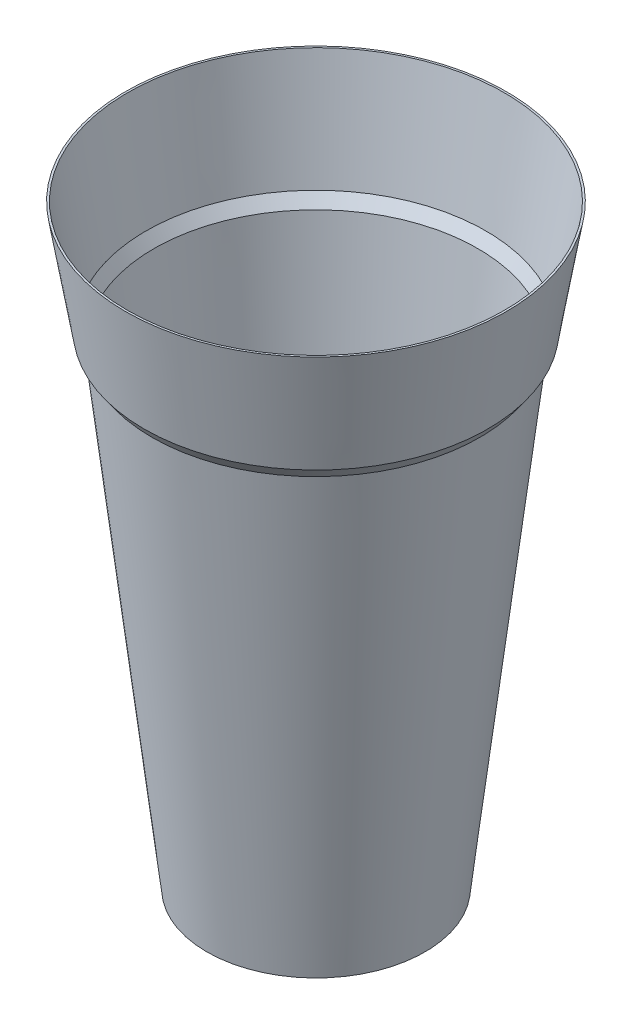
ISO-10303-21;
HEADER;
FILE_DESCRIPTION(('STEP AP214'),'2;1');
FILE_NAME('part.step','',(''),(''),'','','');
FILE_SCHEMA(('AUTOMOTIVE_DESIGN { 1 0 10303 214 1 1 1 1 }'));
ENDSEC;
DATA;
#1=APPLICATION_CONTEXT('core data for automotive mechanical design processes');
#2=APPLICATION_PROTOCOL_DEFINITION('international standard','automotive_design',2000,#1);
#3=PRODUCT_CONTEXT('',#1,'mechanical');
#4=PRODUCT('Part','Part','',(#3));
#5=PRODUCT_RELATED_PRODUCT_CATEGORY('part','',(#4));
#6=PRODUCT_DEFINITION_FORMATION('','',#4);
#7=PRODUCT_DEFINITION_CONTEXT('part definition',#1,'design');
#8=PRODUCT_DEFINITION('design','',#6,#7);
#9=PRODUCT_DEFINITION_SHAPE('','',#8);
#10=(LENGTH_UNIT() NAMED_UNIT(*) SI_UNIT(.MILLI.,.METRE.));
#11=(NAMED_UNIT(*) PLANE_ANGLE_UNIT() SI_UNIT($,.RADIAN.));
#12=(NAMED_UNIT(*) SI_UNIT($,.STERADIAN.) SOLID_ANGLE_UNIT());
#13=UNCERTAINTY_MEASURE_WITH_UNIT(LENGTH_MEASURE(1.E-05),#10,'distance_accuracy_value','');
#14=(GEOMETRIC_REPRESENTATION_CONTEXT(3) GLOBAL_UNCERTAINTY_ASSIGNED_CONTEXT((#13)) GLOBAL_UNIT_ASSIGNED_CONTEXT((#10,
#11,#12)) REPRESENTATION_CONTEXT('',''));
#15=CARTESIAN_POINT('',(0.,0.,0.));
#16=DIRECTION('',(0.,0.,1.));
#17=DIRECTION('',(1.,0.,0.));
#18=AXIS2_PLACEMENT_3D('',#15,#16,#17);
#19=CARTESIAN_POINT('',(-27.5,0.,28.05));
#20=DIRECTION('',(0.,-1.,0.));
#21=DIRECTION('',(0.,0.,-1.));
#22=AXIS2_PLACEMENT_3D('',#19,#20,#21);
#23=PLANE('',#22);
#24=CARTESIAN_POINT('',(0.,0.,0.));
#25=DIRECTION('',(0.,1.,0.));
#26=DIRECTION('',(0.,0.,1.));
#27=AXIS2_PLACEMENT_3D('',#24,#25,#26);
#28=CIRCLE('',#27,27.5);
#29=CARTESIAN_POINT('',(0.,0.,27.5));
#30=VERTEX_POINT('',#29);
#31=EDGE_CURVE('E17',#30,#30,#28,.T.);
#32=ORIENTED_EDGE('',*,*,#31,.F.);
#33=EDGE_LOOP('',(#32));
#34=FACE_BOUND('',#33,.T.);
#35=ADVANCED_FACE('F13',(#34),#23,.T.);
#36=CARTESIAN_POINT('',(0.,0.,0.));
#37=DIRECTION('',(0.,1.,0.));
#38=DIRECTION('',(0.,0.,1.));
#39=AXIS2_PLACEMENT_3D('',#36,#37,#38);
#40=CONICAL_SURFACE('',#39,27.5,0.115191730631625);
#41=CARTESIAN_POINT('',(0.,119.16,0.));
#42=DIRECTION('',(0.,1.,0.));
#43=DIRECTION('',(0.,0.,1.));
#44=AXIS2_PLACEMENT_3D('',#41,#42,#43);
#45=CIRCLE('',#44,41.2872824049611);
#46=CARTESIAN_POINT('',(0.,119.16,41.2872824049611));
#47=VERTEX_POINT('',#46);
#48=EDGE_CURVE('E40',#47,#47,#45,.T.);
#49=ORIENTED_EDGE('',*,*,#48,.F.);
#50=EDGE_LOOP('',(#49));
#51=FACE_BOUND('',#50,.T.);
#52=ORIENTED_EDGE('',*,*,#31,.T.);
#53=EDGE_LOOP('',(#52));
#54=FACE_BOUND('',#53,.T.);
#55=ADVANCED_FACE('F120',(#51,#54),#40,.T.);
#56=CARTESIAN_POINT('',(0.,119.16,0.));
#57=DIRECTION('',(0.,1.,0.));
#58=DIRECTION('',(0.,0.,1.));
#59=AXIS2_PLACEMENT_3D('',#56,#57,#58);
#60=CONICAL_SURFACE('',#59,41.2872824049611,0.613556145511916);
#61=CARTESIAN_POINT('',(0.,122.,0.));
#62=DIRECTION('',(0.,1.,0.));
#63=DIRECTION('',(0.,0.,1.));
#64=AXIS2_PLACEMENT_3D('',#61,#62,#63);
#65=CIRCLE('',#64,43.2872824049611);
#66=CARTESIAN_POINT('',(0.,122.,43.2872824049611));
#67=VERTEX_POINT('',#66);
#68=EDGE_CURVE('E36',#67,#67,#65,.T.);
#69=ORIENTED_EDGE('',*,*,#68,.F.);
#70=EDGE_LOOP('',(#69));
#71=FACE_BOUND('',#70,.T.);
#72=ORIENTED_EDGE('',*,*,#48,.T.);
#73=EDGE_LOOP('',(#72));
#74=FACE_BOUND('',#73,.T.);
#75=ADVANCED_FACE('F110',(#71,#74),#60,.T.);
#76=CARTESIAN_POINT('',(0.,122.,0.));
#77=DIRECTION('',(0.,1.,0.));
#78=DIRECTION('',(0.,0.,1.));
#79=AXIS2_PLACEMENT_3D('',#76,#77,#78);
#80=CONICAL_SURFACE('',#79,43.2872824049611,0.166748474686998);
#81=CARTESIAN_POINT('',(0.,150.,0.));
#82=DIRECTION('',(0.,1.,0.));
#83=DIRECTION('',(0.,0.,1.));
#84=AXIS2_PLACEMENT_3D('',#81,#82,#83);
#85=CIRCLE('',#84,48.);
#86=CARTESIAN_POINT('',(0.,150.,48.));
#87=VERTEX_POINT('',#86);
#88=EDGE_CURVE('E34',#87,#87,#85,.T.);
#89=ORIENTED_EDGE('',*,*,#88,.F.);
#90=EDGE_LOOP('',(#89));
#91=FACE_BOUND('',#90,.T.);
#92=ORIENTED_EDGE('',*,*,#68,.T.);
#93=EDGE_LOOP('',(#92));
#94=FACE_BOUND('',#93,.T.);
#95=ADVANCED_FACE('F70',(#91,#94),#80,.T.);
#96=CARTESIAN_POINT('',(-48.,150.,-48.96));
#97=DIRECTION('',(0.,1.,0.));
#98=DIRECTION('',(0.,0.,1.));
#99=AXIS2_PLACEMENT_3D('',#96,#97,#98);
#100=PLANE('',#99);
#101=CARTESIAN_POINT('',(0.,150.,0.));
#102=DIRECTION('',(0.,1.,0.));
#103=DIRECTION('',(0.,0.,1.));
#104=AXIS2_PLACEMENT_3D('',#101,#102,#103);
#105=CIRCLE('',#104,47.4929672821023);
#106=CARTESIAN_POINT('',(0.,150.,47.4929672821023));
#107=VERTEX_POINT('',#106);
#108=EDGE_CURVE('E32',#107,#107,#105,.T.);
#109=ORIENTED_EDGE('',*,*,#108,.F.);
#110=EDGE_LOOP('',(#109));
#111=FACE_BOUND('',#110,.T.);
#112=ORIENTED_EDGE('',*,*,#88,.T.);
#113=EDGE_LOOP('',(#112));
#114=FACE_BOUND('',#113,.T.);
#115=ADVANCED_FACE('F60',(#111,#114),#100,.T.);
#116=CARTESIAN_POINT('',(0.,150.,0.));
#117=DIRECTION('',(0.,1.,0.));
#118=DIRECTION('',(0.,0.,1.));
#119=AXIS2_PLACEMENT_3D('',#116,#117,#118);
#120=CONICAL_SURFACE('',#119,47.4929672821023,0.166748474686995);
#121=ORIENTED_EDGE('',*,*,#108,.T.);
#122=EDGE_LOOP('',(#121));
#123=FACE_BOUND('',#122,.T.);
#124=CARTESIAN_POINT('',(0.,122.195010860724,0.));
#125=DIRECTION('',(0.,1.,0.));
#126=DIRECTION('',(0.,0.,1.));
#127=AXIS2_PLACEMENT_3D('',#124,#125,#126);
#128=CIRCLE('',#127,42.8130722268691);
#129=CARTESIAN_POINT('',(0.,122.195010860724,42.8130722268691));
#130=VERTEX_POINT('',#129);
#131=EDGE_CURVE('E26',#130,#130,#128,.T.);
#132=ORIENTED_EDGE('',*,*,#131,.F.);
#133=EDGE_LOOP('',(#132));
#134=FACE_BOUND('',#133,.T.);
#135=ADVANCED_FACE('F58',(#123,#134),#120,.F.);
#136=CARTESIAN_POINT('',(0.,122.195010860724,0.));
#137=DIRECTION('',(0.,1.,0.));
#138=DIRECTION('',(0.,0.,1.));
#139=AXIS2_PLACEMENT_3D('',#136,#137,#138);
#140=CONICAL_SURFACE('',#139,42.8130722268691,0.613556145511873);
#141=ORIENTED_EDGE('',*,*,#131,.T.);
#142=EDGE_LOOP('',(#141));
#143=FACE_BOUND('',#142,.T.);
#144=CARTESIAN_POINT('',(0.,119.343860851129,0.));
#145=DIRECTION('',(0.,1.,0.));
#146=DIRECTION('',(0.,0.,1.));
#147=AXIS2_PLACEMENT_3D('',#144,#145,#146);
#148=CIRCLE('',#147,40.8052201074362);
#149=CARTESIAN_POINT('',(0.,119.343860851129,40.8052201074362));
#150=VERTEX_POINT('',#149);
#151=EDGE_CURVE('E21',#150,#150,#148,.T.);
#152=ORIENTED_EDGE('',*,*,#151,.F.);
#153=EDGE_LOOP('',(#152));
#154=FACE_BOUND('',#153,.T.);
#155=ADVANCED_FACE('F55',(#143,#154),#140,.F.);
#156=CARTESIAN_POINT('',(0.,119.343860851129,0.));
#157=DIRECTION('',(0.,1.,0.));
#158=DIRECTION('',(0.,0.,1.));
#159=AXIS2_PLACEMENT_3D('',#156,#157,#158);
#160=CONICAL_SURFACE('',#159,40.8052201074362,0.115191730631625);
#161=ORIENTED_EDGE('',*,*,#151,.T.);
#162=EDGE_LOOP('',(#161));
#163=FACE_BOUND('',#162,.T.);
#164=CARTESIAN_POINT('',(0.,0.5,0.));
#165=DIRECTION('',(0.,1.,0.));
#166=DIRECTION('',(0.,0.,1.));
#167=AXIS2_PLACEMENT_3D('',#164,#165,#166);
#168=CIRCLE('',#167,27.0545162500141);
#169=CARTESIAN_POINT('',(0.,0.5,27.0545162500141));
#170=VERTEX_POINT('',#169);
#171=EDGE_CURVE('E9',#170,#170,#168,.T.);
#172=ORIENTED_EDGE('',*,*,#171,.F.);
#173=EDGE_LOOP('',(#172));
#174=FACE_BOUND('',#173,.T.);
#175=ADVANCED_FACE('F68',(#163,#174),#160,.F.);
#176=CARTESIAN_POINT('',(-27.0545162500141,0.499999999999999,-27.5956065750144));
#177=DIRECTION('',(0.,1.,0.));
#178=DIRECTION('',(0.,0.,1.));
#179=AXIS2_PLACEMENT_3D('',#176,#177,#178);
#180=PLANE('',#179);
#181=ORIENTED_EDGE('',*,*,#171,.T.);
#182=EDGE_LOOP('',(#181));
#183=FACE_BOUND('',#182,.T.);
#184=ADVANCED_FACE('F15',(#183),#180,.T.);
#185=CLOSED_SHELL('',(#35,#55,#75,#95,#115,#135,#155,#175,#184));
#186=MANIFOLD_SOLID_BREP('B1',#185);
#187=ADVANCED_BREP_SHAPE_REPRESENTATION('',(#18,#186),#14);
#188=SHAPE_DEFINITION_REPRESENTATION(#9,#187);
ENDSEC;
END-ISO-10303-21;
